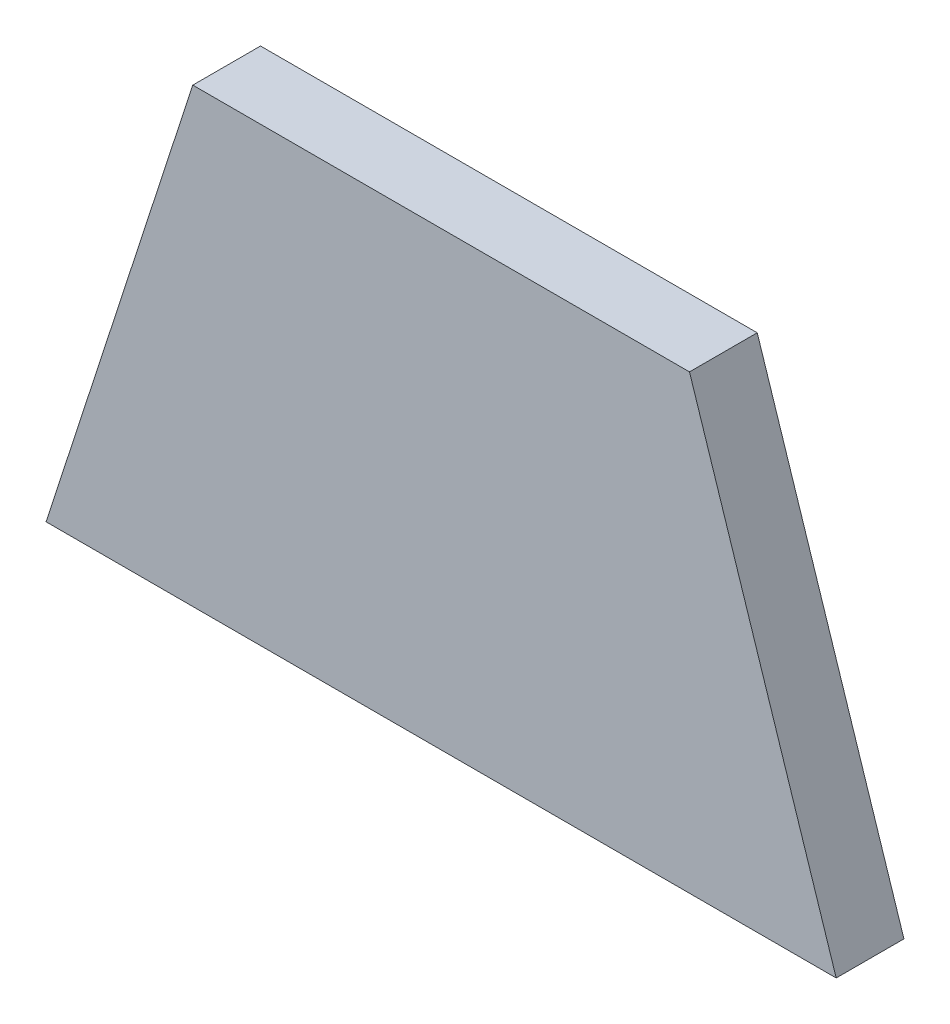
ISO-10303-21;
HEADER;
FILE_DESCRIPTION(('STEP AP214'),'2;1');
FILE_NAME('part.step','',(''),(''),'','','');
FILE_SCHEMA(('AUTOMOTIVE_DESIGN { 1 0 10303 214 1 1 1 1 }'));
ENDSEC;
DATA;
#1=APPLICATION_CONTEXT('core data for automotive mechanical design processes');
#2=APPLICATION_PROTOCOL_DEFINITION('international standard','automotive_design',2000,#1);
#3=PRODUCT_CONTEXT('',#1,'mechanical');
#4=PRODUCT('Part','Part','',(#3));
#5=PRODUCT_RELATED_PRODUCT_CATEGORY('part','',(#4));
#6=PRODUCT_DEFINITION_FORMATION('','',#4);
#7=PRODUCT_DEFINITION_CONTEXT('part definition',#1,'design');
#8=PRODUCT_DEFINITION('design','',#6,#7);
#9=PRODUCT_DEFINITION_SHAPE('','',#8);
#10=(LENGTH_UNIT() NAMED_UNIT(*) SI_UNIT(.MILLI.,.METRE.));
#11=(NAMED_UNIT(*) PLANE_ANGLE_UNIT() SI_UNIT($,.RADIAN.));
#12=(NAMED_UNIT(*) SI_UNIT($,.STERADIAN.) SOLID_ANGLE_UNIT());
#13=UNCERTAINTY_MEASURE_WITH_UNIT(LENGTH_MEASURE(1.E-05),#10,'distance_accuracy_value','');
#14=(GEOMETRIC_REPRESENTATION_CONTEXT(3) GLOBAL_UNCERTAINTY_ASSIGNED_CONTEXT((#13)) GLOBAL_UNIT_ASSIGNED_CONTEXT((#10,
#11,#12)) REPRESENTATION_CONTEXT('',''));
#15=CARTESIAN_POINT('',(0.,0.,0.));
#16=DIRECTION('',(0.,0.,1.));
#17=DIRECTION('',(1.,0.,0.));
#18=AXIS2_PLACEMENT_3D('',#15,#16,#17);
#19=CARTESIAN_POINT('',(32.4919696232907,100.,15.));
#20=DIRECTION('',(0.951056516295153,-0.309016994374948,0.));
#21=DIRECTION('',(0.309016994374948,0.951056516295153,0.));
#22=AXIS2_PLACEMENT_3D('',#19,#20,#21);
#23=PLANE('',#22);
#24=DIRECTION('',(-0.309016994374948,-0.951056516295153,0.));
#25=VECTOR('',#24,1.);
#26=CARTESIAN_POINT('',(32.4919696232907,100.,0.));
#27=LINE('',#26,#25);
#28=CARTESIAN_POINT('',(32.4919696232907,100.,0.));
#29=VERTEX_POINT('',#28);
#30=CARTESIAN_POINT('',(0.,0.,0.));
#31=VERTEX_POINT('',#30);
#32=EDGE_CURVE('E96',#29,#31,#27,.T.);
#33=ORIENTED_EDGE('',*,*,#32,.T.);
#34=DIRECTION('',(0.,0.,-1.));
#35=VECTOR('',#34,1.);
#36=CARTESIAN_POINT('',(0.,0.,15.));
#37=LINE('',#36,#35);
#38=CARTESIAN_POINT('',(0.,0.,15.));
#39=VERTEX_POINT('',#38);
#40=EDGE_CURVE('E11',#39,#31,#37,.T.);
#41=ORIENTED_EDGE('',*,*,#40,.F.);
#42=DIRECTION('',(-0.309016994374948,-0.951056516295153,0.));
#43=VECTOR('',#42,1.);
#44=CARTESIAN_POINT('',(32.4919696232907,100.,15.));
#45=LINE('',#44,#43);
#46=CARTESIAN_POINT('',(32.4919696232907,100.,15.));
#47=VERTEX_POINT('',#46);
#48=EDGE_CURVE('E84',#47,#39,#45,.T.);
#49=ORIENTED_EDGE('',*,*,#48,.F.);
#50=DIRECTION('',(0.,0.,-1.));
#51=VECTOR('',#50,1.);
#52=CARTESIAN_POINT('',(32.4919696232907,100.,15.));
#53=LINE('',#52,#51);
#54=EDGE_CURVE('E92',#47,#29,#53,.T.);
#55=ORIENTED_EDGE('',*,*,#54,.T.);
#56=EDGE_LOOP('',(#33,#41,#49,#55));
#57=FACE_BOUND('',#56,.T.);
#58=ADVANCED_FACE('F33',(#57),#23,.F.);
#59=CARTESIAN_POINT('',(0.,0.,15.));
#60=DIRECTION('',(0.,1.,0.));
#61=DIRECTION('',(0.,0.,1.));
#62=AXIS2_PLACEMENT_3D('',#59,#60,#61);
#63=PLANE('',#62);
#64=DIRECTION('',(1.,0.,0.));
#65=VECTOR('',#64,1.);
#66=CARTESIAN_POINT('',(0.,0.,0.));
#67=LINE('',#66,#65);
#68=CARTESIAN_POINT('',(174.983939246581,0.,0.));
#69=VERTEX_POINT('',#68);
#70=EDGE_CURVE('E88',#31,#69,#67,.T.);
#71=ORIENTED_EDGE('',*,*,#70,.T.);
#72=DIRECTION('',(0.,0.,-1.));
#73=VECTOR('',#72,1.);
#74=CARTESIAN_POINT('',(174.983939246581,0.,15.));
#75=LINE('',#74,#73);
#76=CARTESIAN_POINT('',(174.983939246581,0.,15.));
#77=VERTEX_POINT('',#76);
#78=EDGE_CURVE('E41',#77,#69,#75,.T.);
#79=ORIENTED_EDGE('',*,*,#78,.F.);
#80=DIRECTION('',(1.,0.,0.));
#81=VECTOR('',#80,1.);
#82=CARTESIAN_POINT('',(0.,0.,15.));
#83=LINE('',#82,#81);
#84=EDGE_CURVE('E79',#39,#77,#83,.T.);
#85=ORIENTED_EDGE('',*,*,#84,.F.);
#86=ORIENTED_EDGE('',*,*,#40,.T.);
#87=EDGE_LOOP('',(#71,#79,#85,#86));
#88=FACE_BOUND('',#87,.T.);
#89=ADVANCED_FACE('F87',(#88),#63,.F.);
#90=CARTESIAN_POINT('',(142.491969623291,100.,15.));
#91=DIRECTION('',(-0.951056516295153,-0.309016994374948,0.));
#92=DIRECTION('',(0.309016994374948,-0.951056516295154,0.));
#93=AXIS2_PLACEMENT_3D('',#90,#91,#92);
#94=PLANE('',#93);
#95=DIRECTION('',(-0.309016994374948,0.951056516295153,0.));
#96=VECTOR('',#95,1.);
#97=CARTESIAN_POINT('',(142.491969623291,100.,0.));
#98=LINE('',#97,#96);
#99=CARTESIAN_POINT('',(142.491969623291,100.,0.));
#100=VERTEX_POINT('',#99);
#101=EDGE_CURVE('E66',#69,#100,#98,.T.);
#102=ORIENTED_EDGE('',*,*,#101,.T.);
#103=DIRECTION('',(0.,0.,-1.));
#104=VECTOR('',#103,1.);
#105=CARTESIAN_POINT('',(142.491969623291,100.,15.));
#106=LINE('',#105,#104);
#107=CARTESIAN_POINT('',(142.491969623291,100.,15.));
#108=VERTEX_POINT('',#107);
#109=EDGE_CURVE('E89',#108,#100,#106,.T.);
#110=ORIENTED_EDGE('',*,*,#109,.F.);
#111=DIRECTION('',(-0.309016994374948,0.951056516295153,0.));
#112=VECTOR('',#111,1.);
#113=CARTESIAN_POINT('',(142.491969623291,100.,15.));
#114=LINE('',#113,#112);
#115=EDGE_CURVE('E82',#77,#108,#114,.T.);
#116=ORIENTED_EDGE('',*,*,#115,.F.);
#117=ORIENTED_EDGE('',*,*,#78,.T.);
#118=EDGE_LOOP('',(#102,#110,#116,#117));
#119=FACE_BOUND('',#118,.T.);
#120=ADVANCED_FACE('F90',(#119),#94,.F.);
#121=CARTESIAN_POINT('',(142.491969623291,100.,15.));
#122=DIRECTION('',(0.,-1.,0.));
#123=DIRECTION('',(1.,0.,0.));
#124=AXIS2_PLACEMENT_3D('',#121,#122,#123);
#125=PLANE('',#124);
#126=DIRECTION('',(-1.,0.,0.));
#127=VECTOR('',#126,1.);
#128=CARTESIAN_POINT('',(142.491969623291,100.,0.));
#129=LINE('',#128,#127);
#130=EDGE_CURVE('E72',#100,#29,#129,.T.);
#131=ORIENTED_EDGE('',*,*,#130,.T.);
#132=ORIENTED_EDGE('',*,*,#54,.F.);
#133=DIRECTION('',(-1.,0.,0.));
#134=VECTOR('',#133,1.);
#135=CARTESIAN_POINT('',(142.491969623291,100.,15.));
#136=LINE('',#135,#134);
#137=EDGE_CURVE('E49',#108,#47,#136,.T.);
#138=ORIENTED_EDGE('',*,*,#137,.F.);
#139=ORIENTED_EDGE('',*,*,#109,.T.);
#140=EDGE_LOOP('',(#131,#132,#138,#139));
#141=FACE_BOUND('',#140,.T.);
#142=ADVANCED_FACE('F103',(#141),#125,.F.);
#143=CARTESIAN_POINT('',(0.,0.,15.));
#144=DIRECTION('',(0.,0.,1.));
#145=DIRECTION('',(1.,0.,0.));
#146=AXIS2_PLACEMENT_3D('',#143,#144,#145);
#147=PLANE('',#146);
#148=ORIENTED_EDGE('',*,*,#48,.T.);
#149=ORIENTED_EDGE('',*,*,#84,.T.);
#150=ORIENTED_EDGE('',*,*,#115,.T.);
#151=ORIENTED_EDGE('',*,*,#137,.T.);
#152=EDGE_LOOP('',(#148,#149,#150,#151));
#153=FACE_BOUND('',#152,.T.);
#154=ADVANCED_FACE('F80',(#153),#147,.T.);
#155=CARTESIAN_POINT('',(0.,0.,0.));
#156=DIRECTION('',(0.,0.,1.));
#157=DIRECTION('',(1.,0.,0.));
#158=AXIS2_PLACEMENT_3D('',#155,#156,#157);
#159=PLANE('',#158);
#160=ORIENTED_EDGE('',*,*,#32,.F.);
#161=ORIENTED_EDGE('',*,*,#130,.F.);
#162=ORIENTED_EDGE('',*,*,#101,.F.);
#163=ORIENTED_EDGE('',*,*,#70,.F.);
#164=EDGE_LOOP('',(#160,#161,#162,#163));
#165=FACE_BOUND('',#164,.T.);
#166=ADVANCED_FACE('F106',(#165),#159,.F.);
#167=CLOSED_SHELL('',(#58,#89,#120,#142,#154,#166));
#168=MANIFOLD_SOLID_BREP('B2',#167);
#169=ADVANCED_BREP_SHAPE_REPRESENTATION('',(#18,#168),#14);
#170=SHAPE_DEFINITION_REPRESENTATION(#9,#169);
ENDSEC;
END-ISO-10303-21;
